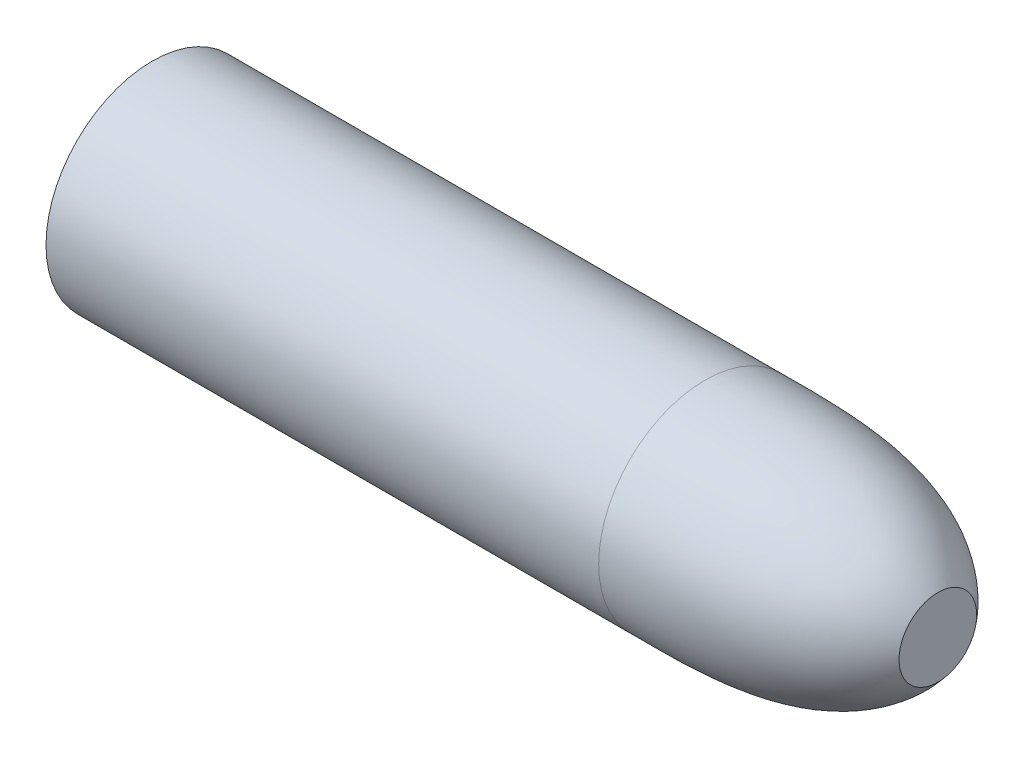
ISO-10303-21;
HEADER;
FILE_DESCRIPTION(('STEP AP214'),'2;1');
FILE_NAME('part.step','',(''),(''),'','','');
FILE_SCHEMA(('AUTOMOTIVE_DESIGN { 1 0 10303 214 1 1 1 1 }'));
ENDSEC;
DATA;
#1=APPLICATION_CONTEXT('core data for automotive mechanical design processes');
#2=APPLICATION_PROTOCOL_DEFINITION('international standard','automotive_design',2000,#1);
#3=PRODUCT_CONTEXT('',#1,'mechanical');
#4=PRODUCT('Part','Part','',(#3));
#5=PRODUCT_RELATED_PRODUCT_CATEGORY('part','',(#4));
#6=PRODUCT_DEFINITION_FORMATION('','',#4);
#7=PRODUCT_DEFINITION_CONTEXT('part definition',#1,'design');
#8=PRODUCT_DEFINITION('design','',#6,#7);
#9=PRODUCT_DEFINITION_SHAPE('','',#8);
#10=(LENGTH_UNIT() NAMED_UNIT(*) SI_UNIT(.MILLI.,.METRE.));
#11=(NAMED_UNIT(*) PLANE_ANGLE_UNIT() SI_UNIT($,.RADIAN.));
#12=(NAMED_UNIT(*) SI_UNIT($,.STERADIAN.) SOLID_ANGLE_UNIT());
#13=UNCERTAINTY_MEASURE_WITH_UNIT(LENGTH_MEASURE(1.E-05),#10,'distance_accuracy_value','');
#14=(GEOMETRIC_REPRESENTATION_CONTEXT(3) GLOBAL_UNCERTAINTY_ASSIGNED_CONTEXT((#13)) GLOBAL_UNIT_ASSIGNED_CONTEXT((#10,
#11,#12)) REPRESENTATION_CONTEXT('',''));
#15=CARTESIAN_POINT('',(0.,0.,0.));
#16=DIRECTION('',(0.,0.,1.));
#17=DIRECTION('',(1.,0.,0.));
#18=AXIS2_PLACEMENT_3D('',#15,#16,#17);
#19=CARTESIAN_POINT('',(257.,12.7,0.));
#20=CARTESIAN_POINT('',(239.015346920491,35.3922843161688,0.));
#21=CARTESIAN_POINT('',(206.626858967021,34.8832790495562,0.));
#22=CARTESIAN_POINT('',(180.8,34.75,0.));
#23=B_SPLINE_CURVE_WITH_KNOTS('',3,(#19,#20,#21,#22),.UNSPECIFIED.,.F.,.F.,(4,4),(0.,1.),.UNSPECIFIED.);
#24=CARTESIAN_POINT('',(0.,0.,0.));
#25=DIRECTION('',(-1.,0.,0.));
#26=AXIS1_PLACEMENT('',#24,#25);
#27=SURFACE_OF_REVOLUTION('',#23,#26);
#28=CARTESIAN_POINT('',(180.8,0.,0.));
#29=DIRECTION('',(-1.,0.,0.));
#30=DIRECTION('',(0.,0.,1.));
#31=AXIS2_PLACEMENT_3D('',#28,#29,#30);
#32=CIRCLE('',#31,34.75);
#33=CARTESIAN_POINT('',(180.8,0.,34.75));
#34=VERTEX_POINT('',#33);
#35=EDGE_CURVE('E50',#34,#34,#32,.T.);
#36=ORIENTED_EDGE('',*,*,#35,.F.);
#37=EDGE_LOOP('',(#36));
#38=FACE_BOUND('',#37,.T.);
#39=CARTESIAN_POINT('',(257.,0.,0.));
#40=DIRECTION('',(-1.,0.,0.));
#41=DIRECTION('',(0.,0.,1.));
#42=AXIS2_PLACEMENT_3D('',#39,#40,#41);
#43=CIRCLE('',#42,12.7);
#44=CARTESIAN_POINT('',(257.,0.,12.7));
#45=VERTEX_POINT('',#44);
#46=EDGE_CURVE('E10',#45,#45,#43,.T.);
#47=ORIENTED_EDGE('',*,*,#46,.T.);
#48=EDGE_LOOP('',(#47));
#49=FACE_BOUND('',#48,.T.);
#50=ADVANCED_FACE('F37',(#38,#49),#27,.T.);
#51=CARTESIAN_POINT('',(257.,0.,0.));
#52=DIRECTION('',(-1.,0.,0.));
#53=DIRECTION('',(0.,0.,1.));
#54=AXIS2_PLACEMENT_3D('',#51,#52,#53);
#55=PLANE('',#54);
#56=ORIENTED_EDGE('',*,*,#46,.F.);
#57=EDGE_LOOP('',(#56));
#58=FACE_BOUND('',#57,.T.);
#59=ADVANCED_FACE('F67',(#58),#55,.F.);
#60=CARTESIAN_POINT('',(0.,0.,0.));
#61=DIRECTION('',(1.,0.,0.));
#62=DIRECTION('',(0.,0.,-1.));
#63=AXIS2_PLACEMENT_3D('',#60,#61,#62);
#64=PLANE('',#63);
#65=CARTESIAN_POINT('',(0.,0.,0.));
#66=DIRECTION('',(-1.,0.,0.));
#67=DIRECTION('',(0.,0.,1.));
#68=AXIS2_PLACEMENT_3D('',#65,#66,#67);
#69=CIRCLE('',#68,34.75);
#70=CARTESIAN_POINT('',(0.,0.,34.75));
#71=VERTEX_POINT('',#70);
#72=EDGE_CURVE('E45',#71,#71,#69,.T.);
#73=ORIENTED_EDGE('',*,*,#72,.T.);
#74=EDGE_LOOP('',(#73));
#75=FACE_BOUND('',#74,.T.);
#76=ADVANCED_FACE('F71',(#75),#64,.F.);
#77=CARTESIAN_POINT('',(0.,0.,0.));
#78=DIRECTION('',(-1.,0.,0.));
#79=DIRECTION('',(0.,0.,1.));
#80=AXIS2_PLACEMENT_3D('',#77,#78,#79);
#81=CYLINDRICAL_SURFACE('',#80,34.75);
#82=ORIENTED_EDGE('',*,*,#72,.F.);
#83=EDGE_LOOP('',(#82));
#84=FACE_BOUND('',#83,.T.);
#85=ORIENTED_EDGE('',*,*,#35,.T.);
#86=EDGE_LOOP('',(#85));
#87=FACE_BOUND('',#86,.T.);
#88=ADVANCED_FACE('F64',(#84,#87),#81,.T.);
#89=CLOSED_SHELL('',(#50,#59,#76,#88));
#90=MANIFOLD_SOLID_BREP('B2',#89);
#91=ADVANCED_BREP_SHAPE_REPRESENTATION('',(#18,#90),#14);
#92=SHAPE_DEFINITION_REPRESENTATION(#9,#91);
ENDSEC;
END-ISO-10303-21;
